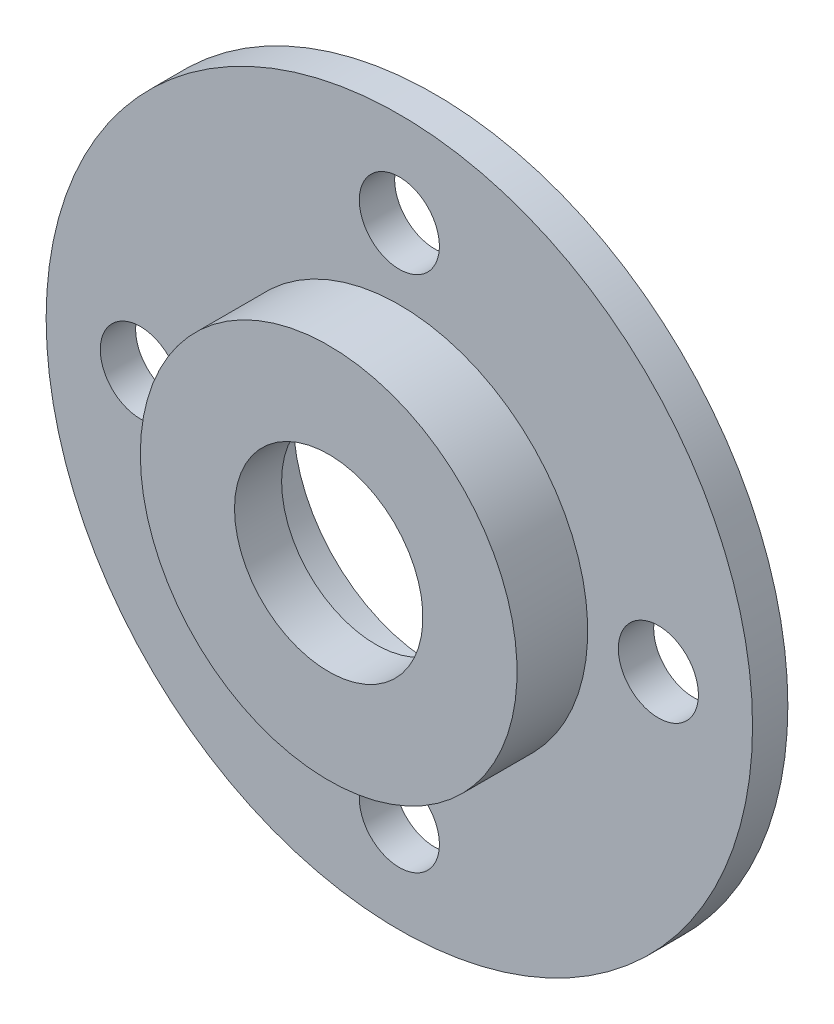
ISO-10303-21;
HEADER;
FILE_DESCRIPTION(('STEP AP214'),'2;1');
FILE_NAME('part.step','',(''),(''),'','','');
FILE_SCHEMA(('AUTOMOTIVE_DESIGN { 1 0 10303 214 1 1 1 1 }'));
ENDSEC;
DATA;
#1=APPLICATION_CONTEXT('core data for automotive mechanical design processes');
#2=APPLICATION_PROTOCOL_DEFINITION('international standard','automotive_design',2000,#1);
#3=PRODUCT_CONTEXT('',#1,'mechanical');
#4=PRODUCT('Part','Part','',(#3));
#5=PRODUCT_RELATED_PRODUCT_CATEGORY('part','',(#4));
#6=PRODUCT_DEFINITION_FORMATION('','',#4);
#7=PRODUCT_DEFINITION_CONTEXT('part definition',#1,'design');
#8=PRODUCT_DEFINITION('design','',#6,#7);
#9=PRODUCT_DEFINITION_SHAPE('','',#8);
#10=(LENGTH_UNIT() NAMED_UNIT(*) SI_UNIT(.MILLI.,.METRE.));
#11=(NAMED_UNIT(*) PLANE_ANGLE_UNIT() SI_UNIT($,.RADIAN.));
#12=(NAMED_UNIT(*) SI_UNIT($,.STERADIAN.) SOLID_ANGLE_UNIT());
#13=UNCERTAINTY_MEASURE_WITH_UNIT(LENGTH_MEASURE(1.E-05),#10,'distance_accuracy_value','');
#14=(GEOMETRIC_REPRESENTATION_CONTEXT(3) GLOBAL_UNCERTAINTY_ASSIGNED_CONTEXT((#13)) GLOBAL_UNIT_ASSIGNED_CONTEXT((#10,
#11,#12)) REPRESENTATION_CONTEXT('',''));
#15=CARTESIAN_POINT('',(0.,0.,0.));
#16=DIRECTION('',(0.,0.,1.));
#17=DIRECTION('',(1.,0.,0.));
#18=AXIS2_PLACEMENT_3D('',#15,#16,#17);
#19=CARTESIAN_POINT('',(0.,0.,-9.65128121719629));
#20=DIRECTION('',(0.,0.,-1.));
#21=DIRECTION('',(-1.,0.,0.));
#22=AXIS2_PLACEMENT_3D('',#19,#20,#21);
#23=CYLINDRICAL_SURFACE('',#22,8.);
#24=CARTESIAN_POINT('',(0.,0.,-2.69866341835701));
#25=DIRECTION('',(0.,0.,-1.));
#26=DIRECTION('',(-1.,0.,0.));
#27=AXIS2_PLACEMENT_3D('',#24,#25,#26);
#28=CIRCLE('',#27,8.);
#29=CARTESIAN_POINT('',(-8.,0.,-2.69866341835701));
#30=VERTEX_POINT('',#29);
#31=EDGE_CURVE('E50',#30,#30,#28,.T.);
#32=ORIENTED_EDGE('',*,*,#31,.F.);
#33=EDGE_LOOP('',(#32));
#34=FACE_BOUND('',#33,.T.);
#35=CARTESIAN_POINT('',(0.,0.,0.301336581642988));
#36=DIRECTION('',(0.,0.,-1.));
#37=DIRECTION('',(-1.,0.,0.));
#38=AXIS2_PLACEMENT_3D('',#35,#36,#37);
#39=CIRCLE('',#38,8.);
#40=CARTESIAN_POINT('',(-8.,0.,0.301336581642989));
#41=VERTEX_POINT('',#40);
#42=EDGE_CURVE('E10',#41,#41,#39,.T.);
#43=ORIENTED_EDGE('',*,*,#42,.T.);
#44=EDGE_LOOP('',(#43));
#45=FACE_BOUND('',#44,.T.);
#46=ADVANCED_FACE('F32',(#34,#45),#23,.T.);
#47=CARTESIAN_POINT('',(4.,0.,0.301336581642987));
#48=DIRECTION('',(0.,0.,-1.));
#49=DIRECTION('',(-1.,0.,0.));
#50=AXIS2_PLACEMENT_3D('',#47,#48,#49);
#51=PLANE('',#50);
#52=ORIENTED_EDGE('',*,*,#42,.F.);
#53=EDGE_LOOP('',(#52));
#54=FACE_BOUND('',#53,.T.);
#55=CARTESIAN_POINT('',(0.,0.,0.301336581642986));
#56=DIRECTION('',(0.,0.,-1.));
#57=DIRECTION('',(-1.,0.,0.));
#58=AXIS2_PLACEMENT_3D('',#55,#56,#57);
#59=CIRCLE('',#58,4.);
#60=CARTESIAN_POINT('',(-4.,0.,0.301336581642987));
#61=VERTEX_POINT('',#60);
#62=EDGE_CURVE('E39',#61,#61,#59,.T.);
#63=ORIENTED_EDGE('',*,*,#62,.T.);
#64=EDGE_LOOP('',(#63));
#65=FACE_BOUND('',#64,.T.);
#66=ADVANCED_FACE('F120',(#54,#65),#51,.F.);
#67=CARTESIAN_POINT('',(0.,0.,-9.65128121719629));
#68=DIRECTION('',(0.,0.,-1.));
#69=DIRECTION('',(-1.,0.,0.));
#70=AXIS2_PLACEMENT_3D('',#67,#68,#69);
#71=CYLINDRICAL_SURFACE('',#70,4.);
#72=ORIENTED_EDGE('',*,*,#62,.F.);
#73=EDGE_LOOP('',(#72));
#74=FACE_BOUND('',#73,.T.);
#75=CARTESIAN_POINT('',(0.,0.,-1.69866341835701));
#76=DIRECTION('',(0.,0.,-1.));
#77=DIRECTION('',(-1.,0.,0.));
#78=AXIS2_PLACEMENT_3D('',#75,#76,#77);
#79=CIRCLE('',#78,4.);
#80=CARTESIAN_POINT('',(-4.,0.,-1.69866341835701));
#81=VERTEX_POINT('',#80);
#82=EDGE_CURVE('E44',#81,#81,#79,.T.);
#83=ORIENTED_EDGE('',*,*,#82,.T.);
#84=EDGE_LOOP('',(#83));
#85=FACE_BOUND('',#84,.T.);
#86=ADVANCED_FACE('F84',(#74,#85),#71,.F.);
#87=CARTESIAN_POINT('',(6.,0.,-1.69866341835701));
#88=DIRECTION('',(0.,0.,1.));
#89=DIRECTION('',(1.,0.,0.));
#90=AXIS2_PLACEMENT_3D('',#87,#88,#89);
#91=PLANE('',#90);
#92=ORIENTED_EDGE('',*,*,#82,.F.);
#93=EDGE_LOOP('',(#92));
#94=FACE_BOUND('',#93,.T.);
#95=CARTESIAN_POINT('',(0.,0.,-1.69866341835701));
#96=DIRECTION('',(0.,0.,-1.));
#97=DIRECTION('',(-1.,0.,0.));
#98=AXIS2_PLACEMENT_3D('',#95,#96,#97);
#99=CIRCLE('',#98,6.);
#100=CARTESIAN_POINT('',(-6.,0.,-1.69866341835701));
#101=VERTEX_POINT('',#100);
#102=EDGE_CURVE('E79',#101,#101,#99,.T.);
#103=ORIENTED_EDGE('',*,*,#102,.T.);
#104=EDGE_LOOP('',(#103));
#105=FACE_BOUND('',#104,.T.);
#106=ADVANCED_FACE('F86',(#94,#105),#91,.F.);
#107=CARTESIAN_POINT('',(0.,0.,-9.65128121719629));
#108=DIRECTION('',(0.,0.,-1.));
#109=DIRECTION('',(-1.,0.,0.));
#110=AXIS2_PLACEMENT_3D('',#107,#108,#109);
#111=CYLINDRICAL_SURFACE('',#110,6.);
#112=ORIENTED_EDGE('',*,*,#102,.F.);
#113=EDGE_LOOP('',(#112));
#114=FACE_BOUND('',#113,.T.);
#115=CARTESIAN_POINT('',(0.,0.,-4.19866341835701));
#116=DIRECTION('',(0.,0.,-1.));
#117=DIRECTION('',(-1.,0.,0.));
#118=AXIS2_PLACEMENT_3D('',#115,#116,#117);
#119=CIRCLE('',#118,6.);
#120=CARTESIAN_POINT('',(-6.,0.,-4.19866341835701));
#121=VERTEX_POINT('',#120);
#122=EDGE_CURVE('E76',#121,#121,#119,.T.);
#123=ORIENTED_EDGE('',*,*,#122,.T.);
#124=EDGE_LOOP('',(#123));
#125=FACE_BOUND('',#124,.T.);
#126=ADVANCED_FACE('F89',(#114,#125),#111,.F.);
#127=CARTESIAN_POINT('',(15.,0.,-4.19866341835701));
#128=DIRECTION('',(0.,0.,1.));
#129=DIRECTION('',(1.,0.,0.));
#130=AXIS2_PLACEMENT_3D('',#127,#128,#129);
#131=PLANE('',#130);
#132=CARTESIAN_POINT('',(0.,11.,-4.19866341835701));
#133=DIRECTION('',(0.,0.,-1.));
#134=DIRECTION('',(-1.,0.,0.));
#135=AXIS2_PLACEMENT_3D('',#132,#133,#134);
#136=CIRCLE('',#135,1.7);
#137=CARTESIAN_POINT('',(-1.69999999999992,11.,-4.19866341835701));
#138=VERTEX_POINT('',#137);
#139=EDGE_CURVE('E150',#138,#138,#136,.T.);
#140=ORIENTED_EDGE('',*,*,#139,.F.);
#141=EDGE_LOOP('',(#140));
#142=FACE_BOUND('',#141,.T.);
#143=CARTESIAN_POINT('',(-11.,0.,-4.19866341835701));
#144=DIRECTION('',(0.,0.,-1.));
#145=DIRECTION('',(-1.,0.,0.));
#146=AXIS2_PLACEMENT_3D('',#143,#144,#145);
#147=CIRCLE('',#146,1.7);
#148=CARTESIAN_POINT('',(-12.7,0.,-4.19866341835701));
#149=VERTEX_POINT('',#148);
#150=EDGE_CURVE('E64',#149,#149,#147,.T.);
#151=ORIENTED_EDGE('',*,*,#150,.F.);
#152=EDGE_LOOP('',(#151));
#153=FACE_BOUND('',#152,.T.);
#154=CARTESIAN_POINT('',(0.,-11.,-4.19866341835701));
#155=DIRECTION('',(0.,0.,-1.));
#156=DIRECTION('',(-1.,0.,0.));
#157=AXIS2_PLACEMENT_3D('',#154,#155,#156);
#158=CIRCLE('',#157,1.7);
#159=CARTESIAN_POINT('',(-1.70000000000003,-11.,-4.19866341835701));
#160=VERTEX_POINT('',#159);
#161=EDGE_CURVE('E54',#160,#160,#158,.T.);
#162=ORIENTED_EDGE('',*,*,#161,.F.);
#163=EDGE_LOOP('',(#162));
#164=FACE_BOUND('',#163,.T.);
#165=CARTESIAN_POINT('',(11.,0.,-4.19866341835701));
#166=DIRECTION('',(0.,0.,-1.));
#167=DIRECTION('',(-1.,0.,0.));
#168=AXIS2_PLACEMENT_3D('',#165,#166,#167);
#169=CIRCLE('',#168,1.7);
#170=CARTESIAN_POINT('',(9.3,0.,-4.19866341835701));
#171=VERTEX_POINT('',#170);
#172=EDGE_CURVE('E51',#171,#171,#169,.T.);
#173=ORIENTED_EDGE('',*,*,#172,.F.);
#174=EDGE_LOOP('',(#173));
#175=FACE_BOUND('',#174,.T.);
#176=ORIENTED_EDGE('',*,*,#122,.F.);
#177=EDGE_LOOP('',(#176));
#178=FACE_BOUND('',#177,.T.);
#179=CARTESIAN_POINT('',(0.,0.,-4.19866341835701));
#180=DIRECTION('',(0.,0.,-1.));
#181=DIRECTION('',(-1.,0.,0.));
#182=AXIS2_PLACEMENT_3D('',#179,#180,#181);
#183=CIRCLE('',#182,15.);
#184=CARTESIAN_POINT('',(-15.,0.,-4.19866341835701));
#185=VERTEX_POINT('',#184);
#186=EDGE_CURVE('E73',#185,#185,#183,.T.);
#187=ORIENTED_EDGE('',*,*,#186,.T.);
#188=EDGE_LOOP('',(#187));
#189=FACE_BOUND('',#188,.T.);
#190=ADVANCED_FACE('F95',(#142,#153,#164,#175,#178,#189),#131,.F.);
#191=CARTESIAN_POINT('',(0.,0.,-9.65128121719629));
#192=DIRECTION('',(0.,0.,-1.));
#193=DIRECTION('',(-1.,0.,0.));
#194=AXIS2_PLACEMENT_3D('',#191,#192,#193);
#195=CYLINDRICAL_SURFACE('',#194,15.);
#196=ORIENTED_EDGE('',*,*,#186,.F.);
#197=EDGE_LOOP('',(#196));
#198=FACE_BOUND('',#197,.T.);
#199=CARTESIAN_POINT('',(0.,0.,-2.69866341835701));
#200=DIRECTION('',(0.,0.,-1.));
#201=DIRECTION('',(-1.,0.,0.));
#202=AXIS2_PLACEMENT_3D('',#199,#200,#201);
#203=CIRCLE('',#202,15.);
#204=CARTESIAN_POINT('',(-15.,0.,-2.69866341835701));
#205=VERTEX_POINT('',#204);
#206=EDGE_CURVE('E70',#205,#205,#203,.T.);
#207=ORIENTED_EDGE('',*,*,#206,.T.);
#208=EDGE_LOOP('',(#207));
#209=FACE_BOUND('',#208,.T.);
#210=ADVANCED_FACE('F101',(#198,#209),#195,.T.);
#211=CARTESIAN_POINT('',(8.,0.,-2.69866341835701));
#212=DIRECTION('',(0.,0.,-1.));
#213=DIRECTION('',(-1.,0.,0.));
#214=AXIS2_PLACEMENT_3D('',#211,#212,#213);
#215=PLANE('',#214);
#216=CARTESIAN_POINT('',(0.,11.,-2.69866341835701));
#217=DIRECTION('',(0.,0.,-1.));
#218=DIRECTION('',(-1.,0.,0.));
#219=AXIS2_PLACEMENT_3D('',#216,#217,#218);
#220=CIRCLE('',#219,1.7);
#221=CARTESIAN_POINT('',(-1.69999999999992,11.,-2.69866341835701));
#222=VERTEX_POINT('',#221);
#223=EDGE_CURVE('E153',#222,#222,#220,.T.);
#224=ORIENTED_EDGE('',*,*,#223,.T.);
#225=EDGE_LOOP('',(#224));
#226=FACE_BOUND('',#225,.T.);
#227=CARTESIAN_POINT('',(-11.,0.,-2.69866341835701));
#228=DIRECTION('',(0.,0.,-1.));
#229=DIRECTION('',(-1.,0.,0.));
#230=AXIS2_PLACEMENT_3D('',#227,#228,#229);
#231=CIRCLE('',#230,1.7);
#232=CARTESIAN_POINT('',(-12.7,0.,-2.69866341835701));
#233=VERTEX_POINT('',#232);
#234=EDGE_CURVE('E35',#233,#233,#231,.T.);
#235=ORIENTED_EDGE('',*,*,#234,.T.);
#236=EDGE_LOOP('',(#235));
#237=FACE_BOUND('',#236,.T.);
#238=CARTESIAN_POINT('',(0.,-11.,-2.69866341835701));
#239=DIRECTION('',(0.,0.,-1.));
#240=DIRECTION('',(-1.,0.,0.));
#241=AXIS2_PLACEMENT_3D('',#238,#239,#240);
#242=CIRCLE('',#241,1.7);
#243=CARTESIAN_POINT('',(-1.70000000000003,-11.,-2.69866341835701));
#244=VERTEX_POINT('',#243);
#245=EDGE_CURVE('E52',#244,#244,#242,.T.);
#246=ORIENTED_EDGE('',*,*,#245,.T.);
#247=EDGE_LOOP('',(#246));
#248=FACE_BOUND('',#247,.T.);
#249=CARTESIAN_POINT('',(11.,0.,-2.69866341835701));
#250=DIRECTION('',(0.,0.,-1.));
#251=DIRECTION('',(-1.,0.,0.));
#252=AXIS2_PLACEMENT_3D('',#249,#250,#251);
#253=CIRCLE('',#252,1.7);
#254=CARTESIAN_POINT('',(9.3,0.,-2.69866341835701));
#255=VERTEX_POINT('',#254);
#256=EDGE_CURVE('E48',#255,#255,#253,.T.);
#257=ORIENTED_EDGE('',*,*,#256,.T.);
#258=EDGE_LOOP('',(#257));
#259=FACE_BOUND('',#258,.T.);
#260=ORIENTED_EDGE('',*,*,#206,.F.);
#261=EDGE_LOOP('',(#260));
#262=FACE_BOUND('',#261,.T.);
#263=ORIENTED_EDGE('',*,*,#31,.T.);
#264=EDGE_LOOP('',(#263));
#265=FACE_BOUND('',#264,.T.);
#266=ADVANCED_FACE('F108',(#226,#237,#248,#259,#262,#265),#215,.F.);
#267=CARTESIAN_POINT('',(11.,0.,-4.19866341835701));
#268=DIRECTION('',(0.,0.,-1.));
#269=DIRECTION('',(-1.,0.,0.));
#270=AXIS2_PLACEMENT_3D('',#267,#268,#269);
#271=CYLINDRICAL_SURFACE('',#270,1.7);
#272=ORIENTED_EDGE('',*,*,#172,.T.);
#273=EDGE_LOOP('',(#272));
#274=FACE_BOUND('',#273,.T.);
#275=ORIENTED_EDGE('',*,*,#256,.F.);
#276=EDGE_LOOP('',(#275));
#277=FACE_BOUND('',#276,.T.);
#278=ADVANCED_FACE('F114',(#274,#277),#271,.F.);
#279=CARTESIAN_POINT('',(0.,-11.,-4.19866341835701));
#280=DIRECTION('',(0.,0.,-1.));
#281=DIRECTION('',(-1.,0.,0.));
#282=AXIS2_PLACEMENT_3D('',#279,#280,#281);
#283=CYLINDRICAL_SURFACE('',#282,1.7);
#284=ORIENTED_EDGE('',*,*,#161,.T.);
#285=EDGE_LOOP('',(#284));
#286=FACE_BOUND('',#285,.T.);
#287=ORIENTED_EDGE('',*,*,#245,.F.);
#288=EDGE_LOOP('',(#287));
#289=FACE_BOUND('',#288,.T.);
#290=ADVANCED_FACE('F134',(#286,#289),#283,.F.);
#291=CARTESIAN_POINT('',(-11.,0.,-4.19866341835701));
#292=DIRECTION('',(0.,0.,-1.));
#293=DIRECTION('',(-1.,0.,0.));
#294=AXIS2_PLACEMENT_3D('',#291,#292,#293);
#295=CYLINDRICAL_SURFACE('',#294,1.7);
#296=ORIENTED_EDGE('',*,*,#150,.T.);
#297=EDGE_LOOP('',(#296));
#298=FACE_BOUND('',#297,.T.);
#299=ORIENTED_EDGE('',*,*,#234,.F.);
#300=EDGE_LOOP('',(#299));
#301=FACE_BOUND('',#300,.T.);
#302=ADVANCED_FACE('F138',(#298,#301),#295,.F.);
#303=CARTESIAN_POINT('',(0.,11.,-4.19866341835701));
#304=DIRECTION('',(0.,0.,-1.));
#305=DIRECTION('',(-1.,0.,0.));
#306=AXIS2_PLACEMENT_3D('',#303,#304,#305);
#307=CYLINDRICAL_SURFACE('',#306,1.7);
#308=ORIENTED_EDGE('',*,*,#139,.T.);
#309=EDGE_LOOP('',(#308));
#310=FACE_BOUND('',#309,.T.);
#311=ORIENTED_EDGE('',*,*,#223,.F.);
#312=EDGE_LOOP('',(#311));
#313=FACE_BOUND('',#312,.T.);
#314=ADVANCED_FACE('F141',(#310,#313),#307,.F.);
#315=CLOSED_SHELL('',(#46,#66,#86,#106,#126,#190,#210,#266,#278,#290,#302,#314));
#316=MANIFOLD_SOLID_BREP('B2',#315);
#317=ADVANCED_BREP_SHAPE_REPRESENTATION('',(#18,#316),#14);
#318=SHAPE_DEFINITION_REPRESENTATION(#9,#317);
ENDSEC;
END-ISO-10303-21;
